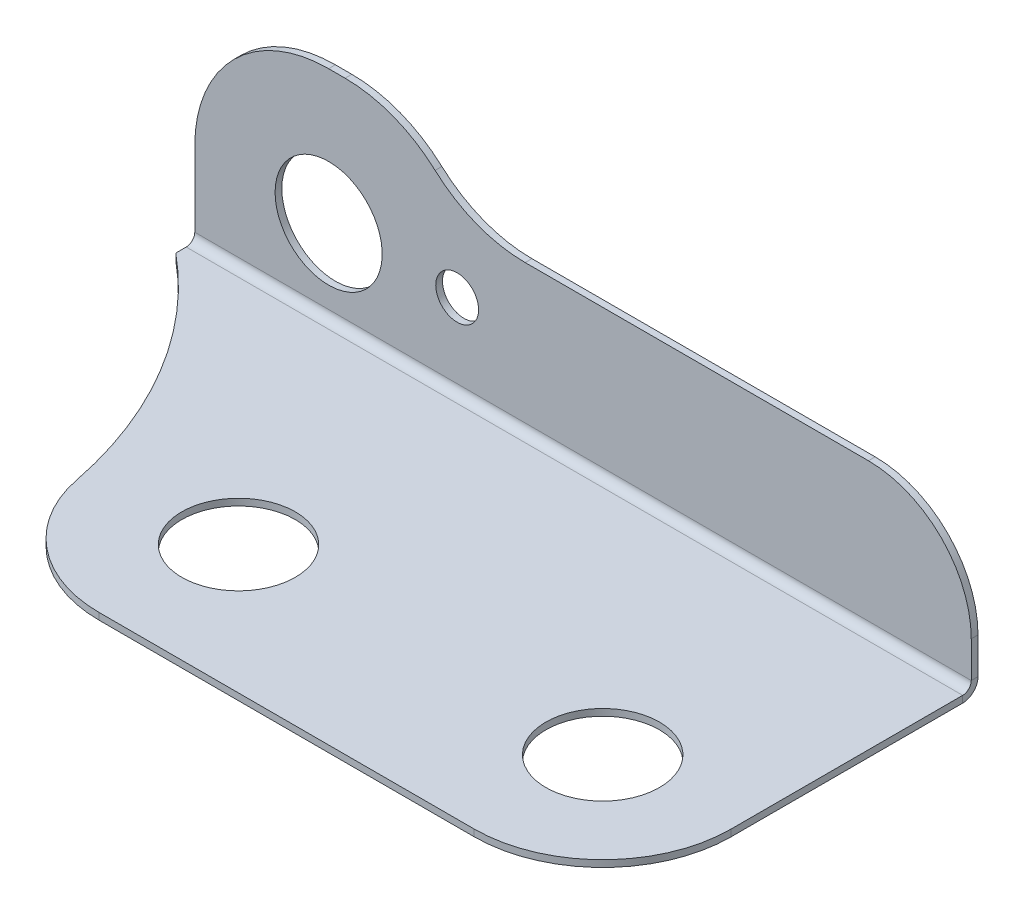
ISO-10303-21;
HEADER;
FILE_DESCRIPTION(('STEP AP214'),'2;1');
FILE_NAME('part.step','',(''),(''),'','','');
FILE_SCHEMA(('AUTOMOTIVE_DESIGN { 1 0 10303 214 1 1 1 1 }'));
ENDSEC;
DATA;
#1=APPLICATION_CONTEXT('core data for automotive mechanical design processes');
#2=APPLICATION_PROTOCOL_DEFINITION('international standard','automotive_design',2000,#1);
#3=PRODUCT_CONTEXT('',#1,'mechanical');
#4=PRODUCT('Part','Part','',(#3));
#5=PRODUCT_RELATED_PRODUCT_CATEGORY('part','',(#4));
#6=PRODUCT_DEFINITION_FORMATION('','',#4);
#7=PRODUCT_DEFINITION_CONTEXT('part definition',#1,'design');
#8=PRODUCT_DEFINITION('design','',#6,#7);
#9=PRODUCT_DEFINITION_SHAPE('','',#8);
#10=(LENGTH_UNIT() NAMED_UNIT(*) SI_UNIT(.MILLI.,.METRE.));
#11=(NAMED_UNIT(*) PLANE_ANGLE_UNIT() SI_UNIT($,.RADIAN.));
#12=(NAMED_UNIT(*) SI_UNIT($,.STERADIAN.) SOLID_ANGLE_UNIT());
#13=UNCERTAINTY_MEASURE_WITH_UNIT(LENGTH_MEASURE(1.E-05),#10,'distance_accuracy_value','');
#14=(GEOMETRIC_REPRESENTATION_CONTEXT(3) GLOBAL_UNCERTAINTY_ASSIGNED_CONTEXT((#13)) GLOBAL_UNIT_ASSIGNED_CONTEXT((#10,
#11,#12)) REPRESENTATION_CONTEXT('',''));
#15=CARTESIAN_POINT('',(0.,0.,0.));
#16=DIRECTION('',(0.,0.,1.));
#17=DIRECTION('',(1.,0.,0.));
#18=AXIS2_PLACEMENT_3D('',#15,#16,#17);
#19=CARTESIAN_POINT('',(-27.6225,-1.524,-14.6328892));
#20=DIRECTION('',(-1.,0.,0.));
#21=DIRECTION('',(0.,1.,0.));
#22=AXIS2_PLACEMENT_3D('',#19,#20,#21);
#23=PLANE('',#22);
#24=DIRECTION('',(0.,0.,-1.));
#25=VECTOR('',#24,1.);
#26=CARTESIAN_POINT('',(-27.6225,-0.616,-14.6328892));
#27=LINE('',#26,#25);
#28=CARTESIAN_POINT('',(-27.6225,-0.616,-14.2328892));
#29=VERTEX_POINT('',#28);
#30=CARTESIAN_POINT('',(-27.6225,-0.616,-14.6328892));
#31=VERTEX_POINT('',#30);
#32=EDGE_CURVE('E11',#29,#31,#27,.T.);
#33=ORIENTED_EDGE('',*,*,#32,.F.);
#34=DIRECTION('',(0.,1.,0.));
#35=VECTOR('',#34,1.);
#36=CARTESIAN_POINT('',(-27.6225,-1.524,-14.2328892));
#37=LINE('',#36,#35);
#38=CARTESIAN_POINT('',(-27.6225,3.81,-14.2328892));
#39=VERTEX_POINT('',#38);
#40=EDGE_CURVE('E112',#29,#39,#37,.T.);
#41=ORIENTED_EDGE('',*,*,#40,.T.);
#42=DIRECTION('',(0.,0.,-1.));
#43=VECTOR('',#42,1.);
#44=CARTESIAN_POINT('',(-27.6225,3.81,-14.6328892));
#45=LINE('',#44,#43);
#46=CARTESIAN_POINT('',(-27.6225,3.81,-14.6328892));
#47=VERTEX_POINT('',#46);
#48=EDGE_CURVE('E49',#39,#47,#45,.T.);
#49=ORIENTED_EDGE('',*,*,#48,.T.);
#50=DIRECTION('',(0.,1.,0.));
#51=VECTOR('',#50,1.);
#52=CARTESIAN_POINT('',(-27.6225,-1.524,-14.6328892));
#53=LINE('',#52,#51);
#54=EDGE_CURVE('E114',#31,#47,#53,.T.);
#55=ORIENTED_EDGE('',*,*,#54,.F.);
#56=EDGE_LOOP('',(#33,#41,#49,#55));
#57=FACE_BOUND('',#56,.T.);
#58=ADVANCED_FACE('F39',(#57),#23,.T.);
#59=CARTESIAN_POINT('',(-19.685,3.81,-14.6328892));
#60=DIRECTION('',(0.,0.,-1.));
#61=DIRECTION('',(-1.,0.,0.));
#62=AXIS2_PLACEMENT_3D('',#59,#60,#61);
#63=CYLINDRICAL_SURFACE('',#62,7.9375);
#64=ORIENTED_EDGE('',*,*,#48,.F.);
#65=CARTESIAN_POINT('',(-19.685,3.81,-14.2328892));
#66=DIRECTION('',(0.,0.,-1.));
#67=DIRECTION('',(-1.,0.,0.));
#68=AXIS2_PLACEMENT_3D('',#65,#66,#67);
#69=CIRCLE('',#68,7.9375);
#70=CARTESIAN_POINT('',(-19.685,11.7475,-14.2328892));
#71=VERTEX_POINT('',#70);
#72=EDGE_CURVE('E139',#39,#71,#69,.T.);
#73=ORIENTED_EDGE('',*,*,#72,.T.);
#74=DIRECTION('',(0.,0.,-1.));
#75=VECTOR('',#74,1.);
#76=CARTESIAN_POINT('',(-19.685,11.7475,-14.6328892));
#77=LINE('',#76,#75);
#78=CARTESIAN_POINT('',(-19.685,11.7475,-14.6328892));
#79=VERTEX_POINT('',#78);
#80=EDGE_CURVE('E190',#71,#79,#77,.T.);
#81=ORIENTED_EDGE('',*,*,#80,.T.);
#82=CARTESIAN_POINT('',(-19.685,3.81,-14.6328892));
#83=DIRECTION('',(0.,0.,-1.));
#84=DIRECTION('',(-1.,0.,0.));
#85=AXIS2_PLACEMENT_3D('',#82,#83,#84);
#86=CIRCLE('',#85,7.9375);
#87=EDGE_CURVE('E204',#47,#79,#86,.T.);
#88=ORIENTED_EDGE('',*,*,#87,.F.);
#89=EDGE_LOOP('',(#64,#73,#81,#88));
#90=FACE_BOUND('',#89,.T.);
#91=ADVANCED_FACE('F210',(#90),#63,.T.);
#92=CARTESIAN_POINT('',(-27.6225,11.7475,-14.6328892));
#93=DIRECTION('',(0.,-1.,0.));
#94=DIRECTION('',(-1.,0.,0.));
#95=AXIS2_PLACEMENT_3D('',#92,#93,#94);
#96=PLANE('',#95);
#97=ORIENTED_EDGE('',*,*,#80,.F.);
#98=DIRECTION('',(-1.,0.,0.));
#99=VECTOR('',#98,1.);
#100=CARTESIAN_POINT('',(18.415,11.7475,-14.2328892));
#101=LINE('',#100,#99);
#102=CARTESIAN_POINT('',(-18.710818623329,11.7475,-14.2328892));
#103=VERTEX_POINT('',#102);
#104=EDGE_CURVE('E154',#103,#71,#101,.T.);
#105=ORIENTED_EDGE('',*,*,#104,.F.);
#106=DIRECTION('',(0.,0.,-1.));
#107=VECTOR('',#106,1.);
#108=CARTESIAN_POINT('',(-18.710818623329,11.7475,-14.6328892));
#109=LINE('',#108,#107);
#110=CARTESIAN_POINT('',(-18.710818623329,11.7475,-14.6328892));
#111=VERTEX_POINT('',#110);
#112=EDGE_CURVE('E187',#103,#111,#109,.T.);
#113=ORIENTED_EDGE('',*,*,#112,.T.);
#114=DIRECTION('',(-1.,0.,0.));
#115=VECTOR('',#114,1.);
#116=CARTESIAN_POINT('',(-27.6225,11.7475,-14.6328892));
#117=LINE('',#116,#115);
#118=EDGE_CURVE('E290',#111,#79,#117,.T.);
#119=ORIENTED_EDGE('',*,*,#118,.T.);
#120=EDGE_LOOP('',(#97,#105,#113,#119));
#121=FACE_BOUND('',#120,.T.);
#122=ADVANCED_FACE('F288',(#121),#96,.F.);
#123=CARTESIAN_POINT('',(-18.710818623329,3.81,-14.6328892));
#124=DIRECTION('',(0.,0.,-1.));
#125=DIRECTION('',(-1.,0.,0.));
#126=AXIS2_PLACEMENT_3D('',#123,#124,#125);
#127=CYLINDRICAL_SURFACE('',#126,7.9375);
#128=ORIENTED_EDGE('',*,*,#112,.F.);
#129=CARTESIAN_POINT('',(-18.710818623329,3.81,-14.2328892));
#130=DIRECTION('',(0.,0.,-1.));
#131=DIRECTION('',(-1.,0.,0.));
#132=AXIS2_PLACEMENT_3D('',#129,#130,#131);
#133=CIRCLE('',#132,7.9375);
#134=CARTESIAN_POINT('',(-13.3720016019749,9.68374999999999,-14.2328892));
#135=VERTEX_POINT('',#134);
#136=EDGE_CURVE('E281',#103,#135,#133,.T.);
#137=ORIENTED_EDGE('',*,*,#136,.T.);
#138=DIRECTION('',(0.,0.,-1.));
#139=VECTOR('',#138,1.);
#140=CARTESIAN_POINT('',(-13.3720016019749,9.68375,-14.6328892));
#141=LINE('',#140,#139);
#142=CARTESIAN_POINT('',(-13.3720016019749,9.68375,-14.6328892));
#143=VERTEX_POINT('',#142);
#144=EDGE_CURVE('E184',#135,#143,#141,.T.);
#145=ORIENTED_EDGE('',*,*,#144,.T.);
#146=CARTESIAN_POINT('',(-18.710818623329,3.81,-14.6328892));
#147=DIRECTION('',(0.,0.,-1.));
#148=DIRECTION('',(-1.,0.,0.));
#149=AXIS2_PLACEMENT_3D('',#146,#147,#148);
#150=CIRCLE('',#149,7.9375);
#151=EDGE_CURVE('E295',#111,#143,#150,.T.);
#152=ORIENTED_EDGE('',*,*,#151,.F.);
#153=EDGE_LOOP('',(#128,#137,#145,#152));
#154=FACE_BOUND('',#153,.T.);
#155=ADVANCED_FACE('F349',(#154),#127,.T.);
#156=CARTESIAN_POINT('',(-8.03318458062082,15.5575,-14.6328892));
#157=DIRECTION('',(0.,0.,-1.));
#158=DIRECTION('',(-1.,0.,0.));
#159=AXIS2_PLACEMENT_3D('',#156,#157,#158);
#160=CYLINDRICAL_SURFACE('',#159,7.9375);
#161=ORIENTED_EDGE('',*,*,#144,.F.);
#162=CARTESIAN_POINT('',(-8.03318458062082,15.5575,-14.2328892));
#163=DIRECTION('',(0.,0.,-1.));
#164=DIRECTION('',(-1.,0.,0.));
#165=AXIS2_PLACEMENT_3D('',#162,#163,#164);
#166=CIRCLE('',#165,7.9375);
#167=CARTESIAN_POINT('',(-8.03318458062081,7.62,-14.2328892));
#168=VERTEX_POINT('',#167);
#169=EDGE_CURVE('E278',#135,#168,#166,.F.);
#170=ORIENTED_EDGE('',*,*,#169,.T.);
#171=DIRECTION('',(0.,0.,-1.));
#172=VECTOR('',#171,1.);
#173=CARTESIAN_POINT('',(-8.03318458062081,7.62,-14.6328892));
#174=LINE('',#173,#172);
#175=CARTESIAN_POINT('',(-8.03318458062081,7.62,-14.6328892));
#176=VERTEX_POINT('',#175);
#177=EDGE_CURVE('E181',#168,#176,#174,.T.);
#178=ORIENTED_EDGE('',*,*,#177,.T.);
#179=CARTESIAN_POINT('',(-8.03318458062082,15.5575,-14.6328892));
#180=DIRECTION('',(0.,0.,-1.));
#181=DIRECTION('',(-1.,0.,0.));
#182=AXIS2_PLACEMENT_3D('',#179,#180,#181);
#183=CIRCLE('',#182,7.9375);
#184=EDGE_CURVE('E298',#143,#176,#183,.F.);
#185=ORIENTED_EDGE('',*,*,#184,.F.);
#186=EDGE_LOOP('',(#161,#170,#178,#185));
#187=FACE_BOUND('',#186,.T.);
#188=ADVANCED_FACE('F352',(#187),#160,.F.);
#189=CARTESIAN_POINT('',(18.415,7.62,-14.6328892));
#190=DIRECTION('',(0.,-1.,0.));
#191=DIRECTION('',(-1.,0.,0.));
#192=AXIS2_PLACEMENT_3D('',#189,#190,#191);
#193=PLANE('',#192);
#194=ORIENTED_EDGE('',*,*,#177,.F.);
#195=DIRECTION('',(-1.,0.,0.));
#196=VECTOR('',#195,1.);
#197=CARTESIAN_POINT('',(18.415,7.62,-14.2328892));
#198=LINE('',#197,#196);
#199=CARTESIAN_POINT('',(12.319,7.62,-14.2328892));
#200=VERTEX_POINT('',#199);
#201=EDGE_CURVE('E275',#200,#168,#198,.T.);
#202=ORIENTED_EDGE('',*,*,#201,.F.);
#203=DIRECTION('',(0.,0.,-1.));
#204=VECTOR('',#203,1.);
#205=CARTESIAN_POINT('',(12.319,7.62,-14.6328892));
#206=LINE('',#205,#204);
#207=CARTESIAN_POINT('',(12.319,7.62,-14.6328892));
#208=VERTEX_POINT('',#207);
#209=EDGE_CURVE('E178',#200,#208,#206,.T.);
#210=ORIENTED_EDGE('',*,*,#209,.T.);
#211=DIRECTION('',(-1.,0.,0.));
#212=VECTOR('',#211,1.);
#213=CARTESIAN_POINT('',(18.415,7.62,-14.6328892));
#214=LINE('',#213,#212);
#215=EDGE_CURVE('E306',#208,#176,#214,.T.);
#216=ORIENTED_EDGE('',*,*,#215,.T.);
#217=EDGE_LOOP('',(#194,#202,#210,#216));
#218=FACE_BOUND('',#217,.T.);
#219=ADVANCED_FACE('F355',(#218),#193,.F.);
#220=CARTESIAN_POINT('',(12.319,1.524,-14.6328892));
#221=DIRECTION('',(0.,0.,-1.));
#222=DIRECTION('',(-1.,0.,0.));
#223=AXIS2_PLACEMENT_3D('',#220,#221,#222);
#224=CYLINDRICAL_SURFACE('',#223,6.096);
#225=ORIENTED_EDGE('',*,*,#209,.F.);
#226=CARTESIAN_POINT('',(12.319,1.524,-14.2328892));
#227=DIRECTION('',(0.,0.,-1.));
#228=DIRECTION('',(-1.,0.,0.));
#229=AXIS2_PLACEMENT_3D('',#226,#227,#228);
#230=CIRCLE('',#229,6.096);
#231=CARTESIAN_POINT('',(18.415,1.524,-14.2328892));
#232=VERTEX_POINT('',#231);
#233=EDGE_CURVE('E272',#200,#232,#230,.T.);
#234=ORIENTED_EDGE('',*,*,#233,.T.);
#235=DIRECTION('',(0.,0.,-1.));
#236=VECTOR('',#235,1.);
#237=CARTESIAN_POINT('',(18.415,1.524,-14.6328892));
#238=LINE('',#237,#236);
#239=CARTESIAN_POINT('',(18.415,1.524,-14.6328892));
#240=VERTEX_POINT('',#239);
#241=EDGE_CURVE('E175',#232,#240,#238,.T.);
#242=ORIENTED_EDGE('',*,*,#241,.T.);
#243=CARTESIAN_POINT('',(12.319,1.524,-14.6328892));
#244=DIRECTION('',(0.,0.,-1.));
#245=DIRECTION('',(-1.,0.,0.));
#246=AXIS2_PLACEMENT_3D('',#243,#244,#245);
#247=CIRCLE('',#246,6.096);
#248=EDGE_CURVE('E309',#208,#240,#247,.T.);
#249=ORIENTED_EDGE('',*,*,#248,.F.);
#250=EDGE_LOOP('',(#225,#234,#242,#249));
#251=FACE_BOUND('',#250,.T.);
#252=ADVANCED_FACE('F358',(#251),#224,.T.);
#253=CARTESIAN_POINT('',(18.415,-1.524,-14.6328892));
#254=DIRECTION('',(-1.,0.,0.));
#255=DIRECTION('',(0.,1.,0.));
#256=AXIS2_PLACEMENT_3D('',#253,#254,#255);
#257=PLANE('',#256);
#258=ORIENTED_EDGE('',*,*,#241,.F.);
#259=DIRECTION('',(0.,1.,0.));
#260=VECTOR('',#259,1.);
#261=CARTESIAN_POINT('',(18.415,-1.524,-14.2328892));
#262=LINE('',#261,#260);
#263=CARTESIAN_POINT('',(18.415,-0.616,-14.2328892));
#264=VERTEX_POINT('',#263);
#265=EDGE_CURVE('E140',#264,#232,#262,.T.);
#266=ORIENTED_EDGE('',*,*,#265,.F.);
#267=DIRECTION('',(0.,0.,-1.));
#268=VECTOR('',#267,1.);
#269=CARTESIAN_POINT('',(18.415,-0.616,-14.6328892));
#270=LINE('',#269,#268);
#271=CARTESIAN_POINT('',(18.415,-0.616,-14.6328892));
#272=VERTEX_POINT('',#271);
#273=EDGE_CURVE('E172',#264,#272,#270,.T.);
#274=ORIENTED_EDGE('',*,*,#273,.T.);
#275=DIRECTION('',(0.,1.,0.));
#276=VECTOR('',#275,1.);
#277=CARTESIAN_POINT('',(18.415,-1.524,-14.6328892));
#278=LINE('',#277,#276);
#279=EDGE_CURVE('E208',#272,#240,#278,.T.);
#280=ORIENTED_EDGE('',*,*,#279,.T.);
#281=EDGE_LOOP('',(#258,#266,#274,#280));
#282=FACE_BOUND('',#281,.T.);
#283=ADVANCED_FACE('F313',(#282),#257,.F.);
#284=CARTESIAN_POINT('',(18.415,-0.616,-13.7248892));
#285=DIRECTION('',(-1.,0.,0.));
#286=DIRECTION('',(0.,0.,1.));
#287=AXIS2_PLACEMENT_3D('',#284,#285,#286);
#288=PLANE('',#287);
#289=ORIENTED_EDGE('',*,*,#273,.F.);
#290=CARTESIAN_POINT('',(18.415,-0.616,-13.7248892));
#291=DIRECTION('',(1.,0.,0.));
#292=DIRECTION('',(0.,0.,-1.));
#293=AXIS2_PLACEMENT_3D('',#290,#291,#292);
#294=CIRCLE('',#293,0.508);
#295=CARTESIAN_POINT('',(18.415,-1.124,-13.7248892));
#296=VERTEX_POINT('',#295);
#297=EDGE_CURVE('E128',#264,#296,#294,.F.);
#298=ORIENTED_EDGE('',*,*,#297,.T.);
#299=DIRECTION('',(0.,-1.,0.));
#300=VECTOR('',#299,1.);
#301=CARTESIAN_POINT('',(18.415,-1.524,-13.7248892));
#302=LINE('',#301,#300);
#303=CARTESIAN_POINT('',(18.415,-1.524,-13.7248892));
#304=VERTEX_POINT('',#303);
#305=EDGE_CURVE('E170',#296,#304,#302,.T.);
#306=ORIENTED_EDGE('',*,*,#305,.T.);
#307=CARTESIAN_POINT('',(18.415,-0.616,-13.7248892));
#308=DIRECTION('',(1.,0.,0.));
#309=DIRECTION('',(0.,0.,-1.));
#310=AXIS2_PLACEMENT_3D('',#307,#308,#309);
#311=CIRCLE('',#310,0.908);
#312=EDGE_CURVE('E243',#272,#304,#311,.F.);
#313=ORIENTED_EDGE('',*,*,#312,.F.);
#314=EDGE_LOOP('',(#289,#298,#306,#313));
#315=FACE_BOUND('',#314,.T.);
#316=ADVANCED_FACE('F323',(#315),#288,.F.);
#317=CARTESIAN_POINT('',(18.415,-1.524,7.62));
#318=DIRECTION('',(1.,0.,0.));
#319=DIRECTION('',(0.,0.,-1.));
#320=AXIS2_PLACEMENT_3D('',#317,#318,#319);
#321=PLANE('',#320);
#322=ORIENTED_EDGE('',*,*,#305,.F.);
#323=DIRECTION('',(0.,0.,1.));
#324=VECTOR('',#323,1.);
#325=CARTESIAN_POINT('',(18.415,-1.124,0.));
#326=LINE('',#325,#324);
#327=CARTESIAN_POINT('',(18.415,-1.124,0.));
#328=VERTEX_POINT('',#327);
#329=EDGE_CURVE('E254',#328,#296,#326,.F.);
#330=ORIENTED_EDGE('',*,*,#329,.F.);
#331=DIRECTION('',(0.,-1.,0.));
#332=VECTOR('',#331,1.);
#333=CARTESIAN_POINT('',(18.415,-1.524,0.));
#334=LINE('',#333,#332);
#335=CARTESIAN_POINT('',(18.415,-1.524,0.));
#336=VERTEX_POINT('',#335);
#337=EDGE_CURVE('E167',#328,#336,#334,.T.);
#338=ORIENTED_EDGE('',*,*,#337,.T.);
#339=DIRECTION('',(0.,0.,-1.));
#340=VECTOR('',#339,1.);
#341=CARTESIAN_POINT('',(18.415,-1.524,7.62));
#342=LINE('',#341,#340);
#343=EDGE_CURVE('E220',#336,#304,#342,.T.);
#344=ORIENTED_EDGE('',*,*,#343,.T.);
#345=EDGE_LOOP('',(#322,#330,#338,#344));
#346=FACE_BOUND('',#345,.T.);
#347=ADVANCED_FACE('F427',(#346),#321,.T.);
#348=CARTESIAN_POINT('',(10.795,-1.524,0.));
#349=DIRECTION('',(0.,1.,0.));
#350=DIRECTION('',(0.,0.,1.));
#351=AXIS2_PLACEMENT_3D('',#348,#349,#350);
#352=CYLINDRICAL_SURFACE('',#351,7.62);
#353=ORIENTED_EDGE('',*,*,#337,.F.);
#354=CARTESIAN_POINT('',(10.795,-1.124,0.));
#355=DIRECTION('',(0.,1.,0.));
#356=DIRECTION('',(0.,0.,1.));
#357=AXIS2_PLACEMENT_3D('',#354,#355,#356);
#358=CIRCLE('',#357,7.62);
#359=CARTESIAN_POINT('',(10.795,-1.124,7.62));
#360=VERTEX_POINT('',#359);
#361=EDGE_CURVE('E266',#328,#360,#358,.F.);
#362=ORIENTED_EDGE('',*,*,#361,.T.);
#363=DIRECTION('',(0.,-1.,0.));
#364=VECTOR('',#363,1.);
#365=CARTESIAN_POINT('',(10.795,-1.524,7.62));
#366=LINE('',#365,#364);
#367=CARTESIAN_POINT('',(10.795,-1.524,7.62));
#368=VERTEX_POINT('',#367);
#369=EDGE_CURVE('E164',#360,#368,#366,.T.);
#370=ORIENTED_EDGE('',*,*,#369,.T.);
#371=CARTESIAN_POINT('',(10.795,-1.524,0.));
#372=DIRECTION('',(0.,1.,0.));
#373=DIRECTION('',(0.,0.,1.));
#374=AXIS2_PLACEMENT_3D('',#371,#372,#373);
#375=CIRCLE('',#374,7.62);
#376=EDGE_CURVE('E223',#336,#368,#375,.F.);
#377=ORIENTED_EDGE('',*,*,#376,.F.);
#378=EDGE_LOOP('',(#353,#362,#370,#377));
#379=FACE_BOUND('',#378,.T.);
#380=ADVANCED_FACE('F423',(#379),#352,.T.);
#381=CARTESIAN_POINT('',(-18.415,-1.524,7.62));
#382=DIRECTION('',(0.,0.,1.));
#383=DIRECTION('',(1.,0.,0.));
#384=AXIS2_PLACEMENT_3D('',#381,#382,#383);
#385=PLANE('',#384);
#386=ORIENTED_EDGE('',*,*,#369,.F.);
#387=DIRECTION('',(1.,0.,0.));
#388=VECTOR('',#387,1.);
#389=CARTESIAN_POINT('',(0.,-1.124,7.62));
#390=LINE('',#389,#388);
#391=CARTESIAN_POINT('',(-11.4331888097694,-1.124,7.62));
#392=VERTEX_POINT('',#391);
#393=EDGE_CURVE('E263',#392,#360,#390,.T.);
#394=ORIENTED_EDGE('',*,*,#393,.F.);
#395=DIRECTION('',(0.,-1.,0.));
#396=VECTOR('',#395,1.);
#397=CARTESIAN_POINT('',(-11.4331888097694,-1.524,7.62));
#398=LINE('',#397,#396);
#399=CARTESIAN_POINT('',(-11.4331888097694,-1.524,7.62));
#400=VERTEX_POINT('',#399);
#401=EDGE_CURVE('E161',#392,#400,#398,.T.);
#402=ORIENTED_EDGE('',*,*,#401,.T.);
#403=DIRECTION('',(1.,0.,0.));
#404=VECTOR('',#403,1.);
#405=CARTESIAN_POINT('',(-18.415,-1.524,7.62));
#406=LINE('',#405,#404);
#407=EDGE_CURVE('E226',#400,#368,#406,.T.);
#408=ORIENTED_EDGE('',*,*,#407,.T.);
#409=EDGE_LOOP('',(#386,#394,#402,#408));
#410=FACE_BOUND('',#409,.T.);
#411=ADVANCED_FACE('F419',(#410),#385,.T.);
#412=CARTESIAN_POINT('',(-11.4331888097694,-1.524,0.));
#413=DIRECTION('',(0.,1.,0.));
#414=DIRECTION('',(0.,0.,1.));
#415=AXIS2_PLACEMENT_3D('',#412,#413,#414);
#416=CYLINDRICAL_SURFACE('',#415,7.62);
#417=ORIENTED_EDGE('',*,*,#401,.F.);
#418=CARTESIAN_POINT('',(-11.4331888097694,-1.124,0.));
#419=DIRECTION('',(0.,1.,0.));
#420=DIRECTION('',(0.,0.,1.));
#421=AXIS2_PLACEMENT_3D('',#418,#419,#420);
#422=CIRCLE('',#421,7.62);
#423=CARTESIAN_POINT('',(-18.9059144690533,-1.124,1.49089611344271));
#424=VERTEX_POINT('',#423);
#425=EDGE_CURVE('E260',#392,#424,#422,.F.);
#426=ORIENTED_EDGE('',*,*,#425,.T.);
#427=DIRECTION('',(0.,-1.,0.));
#428=VECTOR('',#427,1.);
#429=CARTESIAN_POINT('',(-18.9059144690533,-1.524,1.49089611344271));
#430=LINE('',#429,#428);
#431=CARTESIAN_POINT('',(-18.9059144690533,-1.524,1.49089611344271));
#432=VERTEX_POINT('',#431);
#433=EDGE_CURVE('E158',#424,#432,#430,.T.);
#434=ORIENTED_EDGE('',*,*,#433,.T.);
#435=CARTESIAN_POINT('',(-11.4331888097694,-1.524,0.));
#436=DIRECTION('',(0.,1.,0.));
#437=DIRECTION('',(0.,0.,1.));
#438=AXIS2_PLACEMENT_3D('',#435,#436,#437);
#439=CIRCLE('',#438,7.62);
#440=EDGE_CURVE('E229',#400,#432,#439,.F.);
#441=ORIENTED_EDGE('',*,*,#440,.F.);
#442=EDGE_LOOP('',(#417,#426,#434,#441));
#443=FACE_BOUND('',#442,.T.);
#444=ADVANCED_FACE('F416',(#443),#416,.T.);
#445=CARTESIAN_POINT('',(-43.815,-1.524,6.46054982491842));
#446=DIRECTION('',(0.,1.,0.));
#447=DIRECTION('',(0.,0.,1.));
#448=AXIS2_PLACEMENT_3D('',#445,#446,#447);
#449=CYLINDRICAL_SURFACE('',#448,25.4);
#450=ORIENTED_EDGE('',*,*,#433,.F.);
#451=CARTESIAN_POINT('',(-43.815,-1.124,6.46054982491842));
#452=DIRECTION('',(0.,1.,0.));
#453=DIRECTION('',(0.,0.,1.));
#454=AXIS2_PLACEMENT_3D('',#451,#452,#453);
#455=CIRCLE('',#454,25.4);
#456=CARTESIAN_POINT('',(-27.6225,-1.124,-13.1088892));
#457=VERTEX_POINT('',#456);
#458=EDGE_CURVE('E257',#424,#457,#455,.T.);
#459=ORIENTED_EDGE('',*,*,#458,.T.);
#460=DIRECTION('',(0.,-1.,0.));
#461=VECTOR('',#460,1.);
#462=CARTESIAN_POINT('',(-27.6225,-1.524,-13.1088892));
#463=LINE('',#462,#461);
#464=CARTESIAN_POINT('',(-27.6225,-1.524,-13.1088892));
#465=VERTEX_POINT('',#464);
#466=EDGE_CURVE('E155',#457,#465,#463,.T.);
#467=ORIENTED_EDGE('',*,*,#466,.T.);
#468=CARTESIAN_POINT('',(-43.815,-1.524,6.46054982491842));
#469=DIRECTION('',(0.,1.,0.));
#470=DIRECTION('',(0.,0.,1.));
#471=AXIS2_PLACEMENT_3D('',#468,#469,#470);
#472=CIRCLE('',#471,25.4);
#473=EDGE_CURVE('E232',#432,#465,#472,.T.);
#474=ORIENTED_EDGE('',*,*,#473,.F.);
#475=EDGE_LOOP('',(#450,#459,#467,#474));
#476=FACE_BOUND('',#475,.T.);
#477=ADVANCED_FACE('F386',(#476),#449,.F.);
#478=CARTESIAN_POINT('',(-27.6225,-1.524,-14.6328892));
#479=DIRECTION('',(-1.,0.,0.));
#480=DIRECTION('',(0.,0.,1.));
#481=AXIS2_PLACEMENT_3D('',#478,#479,#480);
#482=PLANE('',#481);
#483=ORIENTED_EDGE('',*,*,#466,.F.);
#484=DIRECTION('',(0.,0.,1.));
#485=VECTOR('',#484,1.);
#486=CARTESIAN_POINT('',(-27.6225,-1.124,0.));
#487=LINE('',#486,#485);
#488=CARTESIAN_POINT('',(-27.6225,-1.124,-13.7248892));
#489=VERTEX_POINT('',#488);
#490=EDGE_CURVE('E133',#489,#457,#487,.T.);
#491=ORIENTED_EDGE('',*,*,#490,.F.);
#492=DIRECTION('',(0.,-1.,0.));
#493=VECTOR('',#492,1.);
#494=CARTESIAN_POINT('',(-27.6225,-1.524,-13.7248892));
#495=LINE('',#494,#493);
#496=CARTESIAN_POINT('',(-27.6225,-1.524,-13.7248892));
#497=VERTEX_POINT('',#496);
#498=EDGE_CURVE('E43',#489,#497,#495,.T.);
#499=ORIENTED_EDGE('',*,*,#498,.T.);
#500=DIRECTION('',(0.,0.,1.));
#501=VECTOR('',#500,1.);
#502=CARTESIAN_POINT('',(-27.6225,-1.524,-14.6328892));
#503=LINE('',#502,#501);
#504=EDGE_CURVE('E235',#497,#465,#503,.T.);
#505=ORIENTED_EDGE('',*,*,#504,.T.);
#506=EDGE_LOOP('',(#483,#491,#499,#505));
#507=FACE_BOUND('',#506,.T.);
#508=ADVANCED_FACE('F332',(#507),#482,.T.);
#509=CARTESIAN_POINT('',(-19.685,3.81,-14.6328892));
#510=DIRECTION('',(0.,0.,-1.));
#511=DIRECTION('',(-1.,0.,0.));
#512=AXIS2_PLACEMENT_3D('',#509,#510,#511);
#513=CYLINDRICAL_SURFACE('',#512,3.175);
#514=CARTESIAN_POINT('',(-19.685,3.81,-14.6328892));
#515=DIRECTION('',(0.,0.,-1.));
#516=DIRECTION('',(-1.,0.,0.));
#517=AXIS2_PLACEMENT_3D('',#514,#515,#516);
#518=CIRCLE('',#517,3.175);
#519=CARTESIAN_POINT('',(-22.86,3.81,-14.6328892));
#520=VERTEX_POINT('',#519);
#521=EDGE_CURVE('E246',#520,#520,#518,.T.);
#522=CARTESIAN_POINT('',(-19.685,3.81,-14.2328892));
#523=DIRECTION('',(0.,0.,-1.));
#524=DIRECTION('',(-1.,0.,0.));
#525=AXIS2_PLACEMENT_3D('',#522,#523,#524);
#526=CIRCLE('',#525,3.175);
#527=CARTESIAN_POINT('',(-22.86,3.81,-14.2328892));
#528=VERTEX_POINT('',#527);
#529=EDGE_CURVE('E145',#528,#528,#526,.T.);
#530=CARTESIAN_POINT('',(-22.86,3.81,-14.6328892));
#531=CARTESIAN_POINT('',(-22.86,3.81,-14.6287225333333));
#532=CARTESIAN_POINT('',(-22.86,3.81,-14.6245558666667));
#533=CARTESIAN_POINT('',(-22.86,3.81,-14.6162225333333));
#534=CARTESIAN_POINT('',(-22.86,3.81,-14.6120558666667));
#535=CARTESIAN_POINT('',(-22.86,3.81,-14.6037225333333));
#536=CARTESIAN_POINT('',(-22.86,3.81,-14.5995558666667));
#537=CARTESIAN_POINT('',(-22.86,3.81,-14.5912225333333));
#538=CARTESIAN_POINT('',(-22.86,3.81,-14.5870558666667));
#539=CARTESIAN_POINT('',(-22.86,3.81,-14.5787225333333));
#540=CARTESIAN_POINT('',(-22.86,3.81,-14.5745558666667));
#541=CARTESIAN_POINT('',(-22.86,3.81,-14.5662225333333));
#542=CARTESIAN_POINT('',(-22.86,3.81,-14.5620558666667));
#543=CARTESIAN_POINT('',(-22.86,3.81,-14.5537225333333));
#544=CARTESIAN_POINT('',(-22.86,3.81,-14.5495558666667));
#545=CARTESIAN_POINT('',(-22.86,3.81,-14.5412225333333));
#546=CARTESIAN_POINT('',(-22.86,3.81,-14.5370558666667));
#547=CARTESIAN_POINT('',(-22.86,3.81,-14.5287225333333));
#548=CARTESIAN_POINT('',(-22.86,3.81,-14.5245558666667));
#549=CARTESIAN_POINT('',(-22.86,3.81,-14.5162225333333));
#550=CARTESIAN_POINT('',(-22.86,3.81,-14.5120558666667));
#551=CARTESIAN_POINT('',(-22.86,3.81,-14.5037225333333));
#552=CARTESIAN_POINT('',(-22.86,3.81,-14.4995558666667));
#553=CARTESIAN_POINT('',(-22.86,3.81,-14.4912225333333));
#554=CARTESIAN_POINT('',(-22.86,3.81,-14.4870558666667));
#555=CARTESIAN_POINT('',(-22.86,3.81,-14.4787225333333));
#556=CARTESIAN_POINT('',(-22.86,3.81,-14.4745558666667));
#557=CARTESIAN_POINT('',(-22.86,3.81,-14.4662225333333));
#558=CARTESIAN_POINT('',(-22.86,3.81,-14.4620558666667));
#559=CARTESIAN_POINT('',(-22.86,3.81,-14.4537225333333));
#560=CARTESIAN_POINT('',(-22.86,3.81,-14.4495558666667));
#561=CARTESIAN_POINT('',(-22.86,3.81,-14.4412225333333));
#562=CARTESIAN_POINT('',(-22.86,3.81,-14.4370558666667));
#563=CARTESIAN_POINT('',(-22.86,3.81,-14.4287225333333));
#564=CARTESIAN_POINT('',(-22.86,3.81,-14.4245558666667));
#565=CARTESIAN_POINT('',(-22.86,3.81,-14.4162225333333));
#566=CARTESIAN_POINT('',(-22.86,3.81,-14.4120558666667));
#567=CARTESIAN_POINT('',(-22.86,3.81,-14.4037225333333));
#568=CARTESIAN_POINT('',(-22.86,3.81,-14.3995558666667));
#569=CARTESIAN_POINT('',(-22.86,3.81,-14.3912225333333));
#570=CARTESIAN_POINT('',(-22.86,3.81,-14.3870558666667));
#571=CARTESIAN_POINT('',(-22.86,3.81,-14.3787225333333));
#572=CARTESIAN_POINT('',(-22.86,3.81,-14.3745558666667));
#573=CARTESIAN_POINT('',(-22.86,3.81,-14.3662225333333));
#574=CARTESIAN_POINT('',(-22.86,3.81,-14.3620558666667));
#575=CARTESIAN_POINT('',(-22.86,3.81,-14.3537225333333));
#576=CARTESIAN_POINT('',(-22.86,3.81,-14.3495558666667));
#577=CARTESIAN_POINT('',(-22.86,3.81,-14.3412225333333));
#578=CARTESIAN_POINT('',(-22.86,3.81,-14.3370558666667));
#579=CARTESIAN_POINT('',(-22.86,3.81,-14.3287225333333));
#580=CARTESIAN_POINT('',(-22.86,3.81,-14.3245558666667));
#581=CARTESIAN_POINT('',(-22.86,3.81,-14.3162225333333));
#582=CARTESIAN_POINT('',(-22.86,3.81,-14.3120558666667));
#583=CARTESIAN_POINT('',(-22.86,3.81,-14.3037225333333));
#584=CARTESIAN_POINT('',(-22.86,3.81,-14.2995558666667));
#585=CARTESIAN_POINT('',(-22.86,3.81,-14.2912225333333));
#586=CARTESIAN_POINT('',(-22.86,3.81,-14.2870558666667));
#587=CARTESIAN_POINT('',(-22.86,3.81,-14.2787225333333));
#588=CARTESIAN_POINT('',(-22.86,3.81,-14.2745558666667));
#589=CARTESIAN_POINT('',(-22.86,3.81,-14.2662225333333));
#590=CARTESIAN_POINT('',(-22.86,3.81,-14.2620558666667));
#591=CARTESIAN_POINT('',(-22.86,3.81,-14.2537225333333));
#592=CARTESIAN_POINT('',(-22.86,3.81,-14.2495558666667));
#593=CARTESIAN_POINT('',(-22.86,3.81,-14.2412225333333));
#594=CARTESIAN_POINT('',(-22.86,3.81,-14.2370558666667));
#595=CARTESIAN_POINT('',(-22.86,3.81,-14.2328892));
#596=B_SPLINE_CURVE_WITH_KNOTS('',3,(#530,#531,#532,#533,#534,#535,#536,#537,#538,#539,#540,
#541,#542,#543,#544,#545,#546,#547,#548,#549,#550,#551,#552,#553,#554,#555,#556,#557,#558,#559,
#560,#561,#562,#563,#564,#565,#566,#567,#568,#569,#570,#571,#572,#573,#574,#575,#576,#577,#578,
#579,#580,#581,#582,#583,#584,#585,#586,#587,#588,#589,#590,#591,#592,#593,#594,#595),
.UNSPECIFIED.,.F.,.F.,(4,2,2,2,2,2,2,2,2,2,2,2,2,2,2,2,2,2,2,2,2,2,2,2,2,2,2,2,2,2,2,2,4),(0.,
0.0125000000000004,0.0250000000000007,0.0375000000000011,0.0500000000000014,0.0625000000000001,
0.0750000000000004,0.0875000000000008,0.100000000000001,0.112500000000001,0.125,0.1375,
0.150000000000001,0.162500000000001,0.175,0.1875,0.200000000000001,0.212500000000001,
0.225000000000001,0.2375,0.25,0.262500000000001,0.275000000000001,0.2875,0.3,0.3125,
0.325000000000001,0.337500000000001,0.35,0.3625,0.375,0.387500000000001,0.399999999999999),.UNSPECIFIED.);
#597=EDGE_CURVE('BSEAM377',#520,#528,#596,.T.);
#598=ORIENTED_EDGE('',*,*,#521,.T.);
#599=ORIENTED_EDGE('',*,*,#529,.F.);
#600=ORIENTED_EDGE('',*,*,#597,.T.);
#601=ORIENTED_EDGE('',*,*,#597,.F.);
#602=EDGE_LOOP('',(#598,#600,#599,#601));
#603=FACE_BOUND('',#602,.T.);
#604=ADVANCED_FACE('F377',(#603),#513,.F.);
#605=CARTESIAN_POINT('',(-12.065,3.81,-14.6328892));
#606=DIRECTION('',(0.,0.,-1.));
#607=DIRECTION('',(-1.,0.,0.));
#608=AXIS2_PLACEMENT_3D('',#605,#606,#607);
#609=CYLINDRICAL_SURFACE('',#608,1.27);
#610=CARTESIAN_POINT('',(-12.065,3.81,-14.6328892));
#611=DIRECTION('',(0.,0.,-1.));
#612=DIRECTION('',(-1.,0.,0.));
#613=AXIS2_PLACEMENT_3D('',#610,#611,#612);
#614=CIRCLE('',#613,1.27);
#615=CARTESIAN_POINT('',(-13.335,3.81,-14.6328892));
#616=VERTEX_POINT('',#615);
#617=EDGE_CURVE('E296',#616,#616,#614,.T.);
#618=CARTESIAN_POINT('',(-12.065,3.81,-14.2328892));
#619=DIRECTION('',(0.,0.,-1.));
#620=DIRECTION('',(-1.,0.,0.));
#621=AXIS2_PLACEMENT_3D('',#618,#619,#620);
#622=CIRCLE('',#621,1.27);
#623=CARTESIAN_POINT('',(-13.335,3.81,-14.2328892));
#624=VERTEX_POINT('',#623);
#625=EDGE_CURVE('E151',#624,#624,#622,.T.);
#626=CARTESIAN_POINT('',(-13.335,3.81,-14.6328892));
#627=CARTESIAN_POINT('',(-13.335,3.81,-14.6287225333333));
#628=CARTESIAN_POINT('',(-13.335,3.81,-14.6245558666667));
#629=CARTESIAN_POINT('',(-13.335,3.81,-14.6162225333333));
#630=CARTESIAN_POINT('',(-13.335,3.81,-14.6120558666667));
#631=CARTESIAN_POINT('',(-13.335,3.81,-14.6037225333333));
#632=CARTESIAN_POINT('',(-13.335,3.81,-14.5995558666667));
#633=CARTESIAN_POINT('',(-13.335,3.81,-14.5912225333333));
#634=CARTESIAN_POINT('',(-13.335,3.81,-14.5870558666667));
#635=CARTESIAN_POINT('',(-13.335,3.81,-14.5787225333333));
#636=CARTESIAN_POINT('',(-13.335,3.81,-14.5745558666667));
#637=CARTESIAN_POINT('',(-13.335,3.81,-14.5662225333333));
#638=CARTESIAN_POINT('',(-13.335,3.81,-14.5620558666667));
#639=CARTESIAN_POINT('',(-13.335,3.81,-14.5537225333333));
#640=CARTESIAN_POINT('',(-13.335,3.81,-14.5495558666667));
#641=CARTESIAN_POINT('',(-13.335,3.81,-14.5412225333333));
#642=CARTESIAN_POINT('',(-13.335,3.81,-14.5370558666667));
#643=CARTESIAN_POINT('',(-13.335,3.81,-14.5287225333333));
#644=CARTESIAN_POINT('',(-13.335,3.81,-14.5245558666667));
#645=CARTESIAN_POINT('',(-13.335,3.81,-14.5162225333333));
#646=CARTESIAN_POINT('',(-13.335,3.81,-14.5120558666667));
#647=CARTESIAN_POINT('',(-13.335,3.81,-14.5037225333333));
#648=CARTESIAN_POINT('',(-13.335,3.81,-14.4995558666667));
#649=CARTESIAN_POINT('',(-13.335,3.81,-14.4912225333333));
#650=CARTESIAN_POINT('',(-13.335,3.81,-14.4870558666667));
#651=CARTESIAN_POINT('',(-13.335,3.81,-14.4787225333333));
#652=CARTESIAN_POINT('',(-13.335,3.81,-14.4745558666667));
#653=CARTESIAN_POINT('',(-13.335,3.81,-14.4662225333333));
#654=CARTESIAN_POINT('',(-13.335,3.81,-14.4620558666667));
#655=CARTESIAN_POINT('',(-13.335,3.81,-14.4537225333333));
#656=CARTESIAN_POINT('',(-13.335,3.81,-14.4495558666667));
#657=CARTESIAN_POINT('',(-13.335,3.81,-14.4412225333333));
#658=CARTESIAN_POINT('',(-13.335,3.81,-14.4370558666667));
#659=CARTESIAN_POINT('',(-13.335,3.81,-14.4287225333333));
#660=CARTESIAN_POINT('',(-13.335,3.81,-14.4245558666667));
#661=CARTESIAN_POINT('',(-13.335,3.81,-14.4162225333333));
#662=CARTESIAN_POINT('',(-13.335,3.81,-14.4120558666667));
#663=CARTESIAN_POINT('',(-13.335,3.81,-14.4037225333333));
#664=CARTESIAN_POINT('',(-13.335,3.81,-14.3995558666667));
#665=CARTESIAN_POINT('',(-13.335,3.81,-14.3912225333333));
#666=CARTESIAN_POINT('',(-13.335,3.81,-14.3870558666667));
#667=CARTESIAN_POINT('',(-13.335,3.81,-14.3787225333333));
#668=CARTESIAN_POINT('',(-13.335,3.81,-14.3745558666667));
#669=CARTESIAN_POINT('',(-13.335,3.81,-14.3662225333333));
#670=CARTESIAN_POINT('',(-13.335,3.81,-14.3620558666667));
#671=CARTESIAN_POINT('',(-13.335,3.81,-14.3537225333333));
#672=CARTESIAN_POINT('',(-13.335,3.81,-14.3495558666667));
#673=CARTESIAN_POINT('',(-13.335,3.81,-14.3412225333333));
#674=CARTESIAN_POINT('',(-13.335,3.81,-14.3370558666667));
#675=CARTESIAN_POINT('',(-13.335,3.81,-14.3287225333333));
#676=CARTESIAN_POINT('',(-13.335,3.81,-14.3245558666667));
#677=CARTESIAN_POINT('',(-13.335,3.81,-14.3162225333333));
#678=CARTESIAN_POINT('',(-13.335,3.81,-14.3120558666667));
#679=CARTESIAN_POINT('',(-13.335,3.81,-14.3037225333333));
#680=CARTESIAN_POINT('',(-13.335,3.81,-14.2995558666667));
#681=CARTESIAN_POINT('',(-13.335,3.81,-14.2912225333333));
#682=CARTESIAN_POINT('',(-13.335,3.81,-14.2870558666667));
#683=CARTESIAN_POINT('',(-13.335,3.81,-14.2787225333333));
#684=CARTESIAN_POINT('',(-13.335,3.81,-14.2745558666667));
#685=CARTESIAN_POINT('',(-13.335,3.81,-14.2662225333333));
#686=CARTESIAN_POINT('',(-13.335,3.81,-14.2620558666667));
#687=CARTESIAN_POINT('',(-13.335,3.81,-14.2537225333333));
#688=CARTESIAN_POINT('',(-13.335,3.81,-14.2495558666667));
#689=CARTESIAN_POINT('',(-13.335,3.81,-14.2412225333333));
#690=CARTESIAN_POINT('',(-13.335,3.81,-14.2370558666667));
#691=CARTESIAN_POINT('',(-13.335,3.81,-14.2328892));
#692=B_SPLINE_CURVE_WITH_KNOTS('',3,(#626,#627,#628,#629,#630,#631,#632,#633,#634,#635,#636,
#637,#638,#639,#640,#641,#642,#643,#644,#645,#646,#647,#648,#649,#650,#651,#652,#653,#654,#655,
#656,#657,#658,#659,#660,#661,#662,#663,#664,#665,#666,#667,#668,#669,#670,#671,#672,#673,#674,
#675,#676,#677,#678,#679,#680,#681,#682,#683,#684,#685,#686,#687,#688,#689,#690,#691),
.UNSPECIFIED.,.F.,.F.,(4,2,2,2,2,2,2,2,2,2,2,2,2,2,2,2,2,2,2,2,2,2,2,2,2,2,2,2,2,2,2,2,4),(0.,
0.0124999999999986,0.024999999999999,0.0374999999999993,0.0499999999999997,0.0624999999999983,
0.0749999999999987,0.087499999999999,0.0999999999999994,0.1125,0.124999999999998,
0.137499999999999,0.149999999999999,0.162499999999999,0.174999999999998,0.187499999999998,
0.199999999999999,0.212499999999999,0.225,0.237499999999998,0.249999999999999,0.262499999999999,
0.274999999999999,0.287499999999998,0.299999999999998,0.312499999999999,0.324999999999999,
0.337499999999999,0.349999999999998,0.362499999999998,0.374999999999999,0.387499999999999,
0.399999999999998),.UNSPECIFIED.);
#693=EDGE_CURVE('BSEAM41',#616,#624,#692,.T.);
#694=ORIENTED_EDGE('',*,*,#617,.T.);
#695=ORIENTED_EDGE('',*,*,#625,.F.);
#696=ORIENTED_EDGE('',*,*,#693,.T.);
#697=ORIENTED_EDGE('',*,*,#693,.F.);
#698=EDGE_LOOP('',(#694,#696,#695,#697));
#699=FACE_BOUND('',#698,.T.);
#700=ADVANCED_FACE('F41',(#699),#609,.F.);
#701=CARTESIAN_POINT('',(10.795,-1.524,0.));
#702=DIRECTION('',(0.,1.,0.));
#703=DIRECTION('',(0.,0.,1.));
#704=AXIS2_PLACEMENT_3D('',#701,#702,#703);
#705=CYLINDRICAL_SURFACE('',#704,3.3655);
#706=CARTESIAN_POINT('',(10.795,-1.524,0.));
#707=DIRECTION('',(0.,-1.,0.));
#708=DIRECTION('',(0.,0.,-1.));
#709=AXIS2_PLACEMENT_3D('',#706,#707,#708);
#710=CIRCLE('',#709,3.3655);
#711=CARTESIAN_POINT('',(10.795,-1.524,-3.3655));
#712=VERTEX_POINT('',#711);
#713=EDGE_CURVE('E211',#712,#712,#710,.T.);
#714=ORIENTED_EDGE('',*,*,#713,.T.);
#715=EDGE_LOOP('',(#714));
#716=FACE_BOUND('',#715,.T.);
#717=CARTESIAN_POINT('',(10.795,-1.124,0.));
#718=DIRECTION('',(0.,-1.,0.));
#719=DIRECTION('',(0.,0.,-1.));
#720=AXIS2_PLACEMENT_3D('',#717,#718,#719);
#721=CIRCLE('',#720,3.3655);
#722=CARTESIAN_POINT('',(10.795,-1.124,-3.3655));
#723=VERTEX_POINT('',#722);
#724=EDGE_CURVE('E248',#723,#723,#721,.T.);
#725=ORIENTED_EDGE('',*,*,#724,.F.);
#726=EDGE_LOOP('',(#725));
#727=FACE_BOUND('',#726,.T.);
#728=ADVANCED_FACE('F384',(#716,#727),#705,.F.);
#729=CARTESIAN_POINT('',(-10.795,-1.524,0.));
#730=DIRECTION('',(0.,1.,0.));
#731=DIRECTION('',(0.,0.,1.));
#732=AXIS2_PLACEMENT_3D('',#729,#730,#731);
#733=CYLINDRICAL_SURFACE('',#732,3.3655);
#734=CARTESIAN_POINT('',(-10.795,-1.524,0.));
#735=DIRECTION('',(0.,-1.,0.));
#736=DIRECTION('',(0.,0.,-1.));
#737=AXIS2_PLACEMENT_3D('',#734,#735,#736);
#738=CIRCLE('',#737,3.3655);
#739=CARTESIAN_POINT('',(-10.795,-1.524,-3.3655));
#740=VERTEX_POINT('',#739);
#741=EDGE_CURVE('E214',#740,#740,#738,.T.);
#742=ORIENTED_EDGE('',*,*,#741,.T.);
#743=EDGE_LOOP('',(#742));
#744=FACE_BOUND('',#743,.T.);
#745=CARTESIAN_POINT('',(-10.795,-1.124,0.));
#746=DIRECTION('',(0.,-1.,0.));
#747=DIRECTION('',(0.,0.,-1.));
#748=AXIS2_PLACEMENT_3D('',#745,#746,#747);
#749=CIRCLE('',#748,3.3655);
#750=CARTESIAN_POINT('',(-10.795,-1.124,-3.3655));
#751=VERTEX_POINT('',#750);
#752=EDGE_CURVE('E251',#751,#751,#749,.T.);
#753=ORIENTED_EDGE('',*,*,#752,.F.);
#754=EDGE_LOOP('',(#753));
#755=FACE_BOUND('',#754,.T.);
#756=ADVANCED_FACE('F376',(#744,#755),#733,.F.);
#757=CARTESIAN_POINT('',(-27.6225,-0.616,-13.7248892));
#758=DIRECTION('',(-1.,0.,0.));
#759=DIRECTION('',(0.,0.,1.));
#760=AXIS2_PLACEMENT_3D('',#757,#758,#759);
#761=PLANE('',#760);
#762=CARTESIAN_POINT('',(-27.6225,-0.616,-13.7248892));
#763=DIRECTION('',(1.,0.,0.));
#764=DIRECTION('',(0.,0.,-1.));
#765=AXIS2_PLACEMENT_3D('',#762,#763,#764);
#766=CIRCLE('',#765,0.508);
#767=EDGE_CURVE('E126',#489,#29,#766,.T.);
#768=ORIENTED_EDGE('',*,*,#767,.T.);
#769=ORIENTED_EDGE('',*,*,#32,.T.);
#770=CARTESIAN_POINT('',(-27.6225,-0.616,-13.7248892));
#771=DIRECTION('',(1.,0.,0.));
#772=DIRECTION('',(0.,0.,-1.));
#773=AXIS2_PLACEMENT_3D('',#770,#771,#772);
#774=CIRCLE('',#773,0.908);
#775=EDGE_CURVE('E241',#497,#31,#774,.T.);
#776=ORIENTED_EDGE('',*,*,#775,.F.);
#777=ORIENTED_EDGE('',*,*,#498,.F.);
#778=EDGE_LOOP('',(#768,#769,#776,#777));
#779=FACE_BOUND('',#778,.T.);
#780=ADVANCED_FACE('F142',(#779),#761,.T.);
#781=CARTESIAN_POINT('',(0.,-1.524,0.));
#782=DIRECTION('',(0.,1.,0.));
#783=DIRECTION('',(0.,0.,1.));
#784=AXIS2_PLACEMENT_3D('',#781,#782,#783);
#785=PLANE('',#784);
#786=ORIENTED_EDGE('',*,*,#713,.F.);
#787=EDGE_LOOP('',(#786));
#788=FACE_BOUND('',#787,.T.);
#789=ORIENTED_EDGE('',*,*,#741,.F.);
#790=EDGE_LOOP('',(#789));
#791=FACE_BOUND('',#790,.T.);
#792=ORIENTED_EDGE('',*,*,#504,.F.);
#793=DIRECTION('',(-1.,0.,0.));
#794=VECTOR('',#793,1.);
#795=CARTESIAN_POINT('',(18.415,-1.524,-13.7248892));
#796=LINE('',#795,#794);
#797=EDGE_CURVE('E238',#497,#304,#796,.F.);
#798=ORIENTED_EDGE('',*,*,#797,.T.);
#799=ORIENTED_EDGE('',*,*,#343,.F.);
#800=ORIENTED_EDGE('',*,*,#376,.T.);
#801=ORIENTED_EDGE('',*,*,#407,.F.);
#802=ORIENTED_EDGE('',*,*,#440,.T.);
#803=ORIENTED_EDGE('',*,*,#473,.T.);
#804=EDGE_LOOP('',(#792,#798,#799,#800,#801,#802,#803));
#805=FACE_BOUND('',#804,.T.);
#806=ADVANCED_FACE('F329',(#788,#791,#805),#785,.F.);
#807=CARTESIAN_POINT('',(18.415,-1.524,-14.6328892));
#808=DIRECTION('',(0.,0.,-1.));
#809=DIRECTION('',(-1.,0.,0.));
#810=AXIS2_PLACEMENT_3D('',#807,#808,#809);
#811=PLANE('',#810);
#812=ORIENTED_EDGE('',*,*,#521,.F.);
#813=EDGE_LOOP('',(#812));
#814=FACE_BOUND('',#813,.T.);
#815=ORIENTED_EDGE('',*,*,#617,.F.);
#816=EDGE_LOOP('',(#815));
#817=FACE_BOUND('',#816,.T.);
#818=ORIENTED_EDGE('',*,*,#279,.F.);
#819=DIRECTION('',(-1.,0.,0.));
#820=VECTOR('',#819,1.);
#821=CARTESIAN_POINT('',(-27.6225,-0.616,-14.6328892));
#822=LINE('',#821,#820);
#823=EDGE_CURVE('E207',#272,#31,#822,.T.);
#824=ORIENTED_EDGE('',*,*,#823,.T.);
#825=ORIENTED_EDGE('',*,*,#54,.T.);
#826=ORIENTED_EDGE('',*,*,#87,.T.);
#827=ORIENTED_EDGE('',*,*,#118,.F.);
#828=ORIENTED_EDGE('',*,*,#151,.T.);
#829=ORIENTED_EDGE('',*,*,#184,.T.);
#830=ORIENTED_EDGE('',*,*,#215,.F.);
#831=ORIENTED_EDGE('',*,*,#248,.T.);
#832=EDGE_LOOP('',(#818,#824,#825,#826,#827,#828,#829,#830,#831));
#833=FACE_BOUND('',#832,.T.);
#834=ADVANCED_FACE('F202',(#814,#817,#833),#811,.T.);
#835=CARTESIAN_POINT('',(18.415,-0.616,-13.7248892));
#836=DIRECTION('',(1.,0.,0.));
#837=DIRECTION('',(0.,0.,-1.));
#838=AXIS2_PLACEMENT_3D('',#835,#836,#837);
#839=CYLINDRICAL_SURFACE('',#838,0.908);
#840=ORIENTED_EDGE('',*,*,#312,.T.);
#841=ORIENTED_EDGE('',*,*,#797,.F.);
#842=ORIENTED_EDGE('',*,*,#775,.T.);
#843=ORIENTED_EDGE('',*,*,#823,.F.);
#844=EDGE_LOOP('',(#840,#841,#842,#843));
#845=FACE_BOUND('',#844,.T.);
#846=ADVANCED_FACE('F326',(#845),#839,.T.);
#847=CARTESIAN_POINT('',(0.,-1.124,0.));
#848=DIRECTION('',(0.,1.,0.));
#849=DIRECTION('',(0.,0.,1.));
#850=AXIS2_PLACEMENT_3D('',#847,#848,#849);
#851=PLANE('',#850);
#852=ORIENTED_EDGE('',*,*,#724,.T.);
#853=EDGE_LOOP('',(#852));
#854=FACE_BOUND('',#853,.T.);
#855=ORIENTED_EDGE('',*,*,#752,.T.);
#856=EDGE_LOOP('',(#855));
#857=FACE_BOUND('',#856,.T.);
#858=ORIENTED_EDGE('',*,*,#490,.T.);
#859=ORIENTED_EDGE('',*,*,#458,.F.);
#860=ORIENTED_EDGE('',*,*,#425,.F.);
#861=ORIENTED_EDGE('',*,*,#393,.T.);
#862=ORIENTED_EDGE('',*,*,#361,.F.);
#863=ORIENTED_EDGE('',*,*,#329,.T.);
#864=DIRECTION('',(1.,0.,0.));
#865=VECTOR('',#864,1.);
#866=CARTESIAN_POINT('',(0.,-1.124,-13.7248892));
#867=LINE('',#866,#865);
#868=EDGE_CURVE('E132',#489,#296,#867,.T.);
#869=ORIENTED_EDGE('',*,*,#868,.F.);
#870=EDGE_LOOP('',(#858,#859,#860,#861,#862,#863,#869));
#871=FACE_BOUND('',#870,.T.);
#872=ADVANCED_FACE('F395',(#854,#857,#871),#851,.T.);
#873=CARTESIAN_POINT('',(18.415,-1.524,-14.2328892));
#874=DIRECTION('',(0.,0.,-1.));
#875=DIRECTION('',(-1.,0.,0.));
#876=AXIS2_PLACEMENT_3D('',#873,#874,#875);
#877=PLANE('',#876);
#878=ORIENTED_EDGE('',*,*,#529,.T.);
#879=EDGE_LOOP('',(#878));
#880=FACE_BOUND('',#879,.T.);
#881=ORIENTED_EDGE('',*,*,#625,.T.);
#882=EDGE_LOOP('',(#881));
#883=FACE_BOUND('',#882,.T.);
#884=ORIENTED_EDGE('',*,*,#265,.T.);
#885=ORIENTED_EDGE('',*,*,#233,.F.);
#886=ORIENTED_EDGE('',*,*,#201,.T.);
#887=ORIENTED_EDGE('',*,*,#169,.F.);
#888=ORIENTED_EDGE('',*,*,#136,.F.);
#889=ORIENTED_EDGE('',*,*,#104,.T.);
#890=ORIENTED_EDGE('',*,*,#72,.F.);
#891=ORIENTED_EDGE('',*,*,#40,.F.);
#892=DIRECTION('',(-1.,0.,0.));
#893=VECTOR('',#892,1.);
#894=CARTESIAN_POINT('',(18.415,-0.616,-14.2328892));
#895=LINE('',#894,#893);
#896=EDGE_CURVE('E123',#264,#29,#895,.T.);
#897=ORIENTED_EDGE('',*,*,#896,.F.);
#898=EDGE_LOOP('',(#884,#885,#886,#887,#888,#889,#890,#891,#897));
#899=FACE_BOUND('',#898,.T.);
#900=ADVANCED_FACE('F136',(#880,#883,#899),#877,.F.);
#901=CARTESIAN_POINT('',(18.415,-0.616,-13.7248892));
#902=DIRECTION('',(1.,0.,0.));
#903=DIRECTION('',(0.,0.,-1.));
#904=AXIS2_PLACEMENT_3D('',#901,#902,#903);
#905=CYLINDRICAL_SURFACE('',#904,0.508);
#906=ORIENTED_EDGE('',*,*,#297,.F.);
#907=ORIENTED_EDGE('',*,*,#896,.T.);
#908=ORIENTED_EDGE('',*,*,#767,.F.);
#909=ORIENTED_EDGE('',*,*,#868,.T.);
#910=EDGE_LOOP('',(#906,#907,#908,#909));
#911=FACE_BOUND('',#910,.T.);
#912=ADVANCED_FACE('F124',(#911),#905,.F.);
#913=CLOSED_SHELL('',(#58,#91,#122,#155,#188,#219,#252,#283,#316,#347,#380,#411,#444,#477,#508,
#604,#700,#728,#756,#780,#806,#834,#846,#872,#900,#912));
#914=MANIFOLD_SOLID_BREP('B2',#913);
#915=ADVANCED_BREP_SHAPE_REPRESENTATION('',(#18,#914),#14);
#916=SHAPE_DEFINITION_REPRESENTATION(#9,#915);
ENDSEC;
END-ISO-10303-21;
